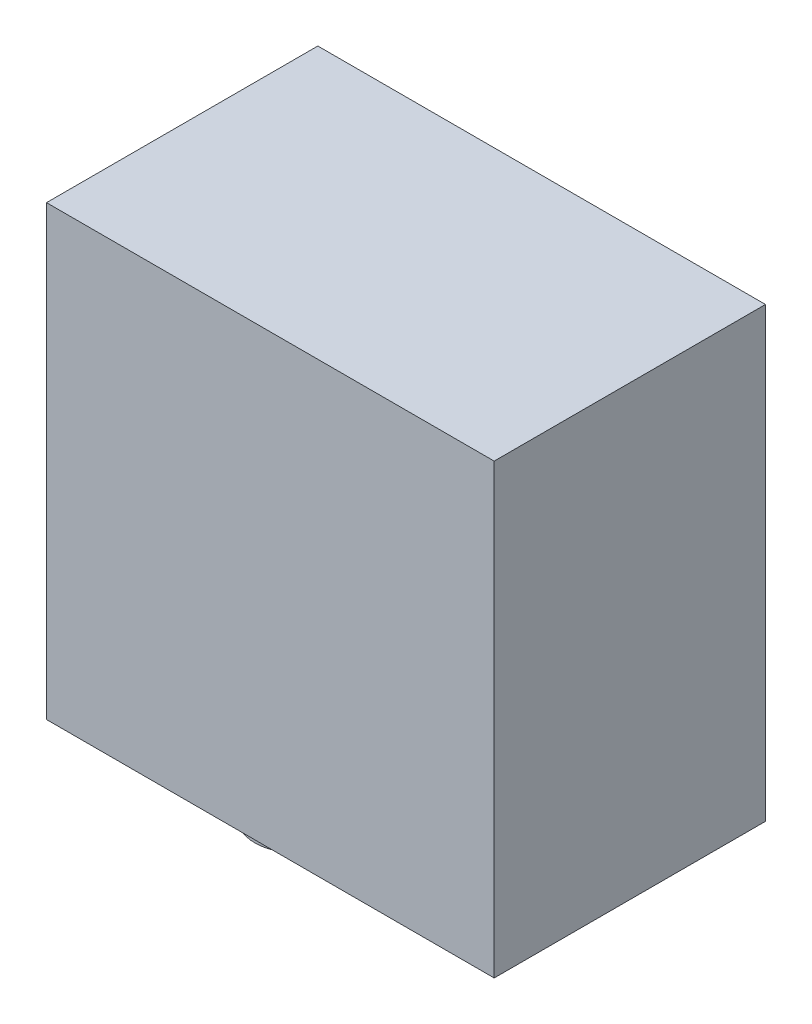
ISO-10303-21;
HEADER;
FILE_DESCRIPTION(('STEP AP214'),'2;1');
FILE_NAME('part.step','',(''),(''),'','','');
FILE_SCHEMA(('AUTOMOTIVE_DESIGN { 1 0 10303 214 1 1 1 1 }'));
ENDSEC;
DATA;
#1=APPLICATION_CONTEXT('core data for automotive mechanical design processes');
#2=APPLICATION_PROTOCOL_DEFINITION('international standard','automotive_design',2000,#1);
#3=PRODUCT_CONTEXT('',#1,'mechanical');
#4=PRODUCT('Part','Part','',(#3));
#5=PRODUCT_RELATED_PRODUCT_CATEGORY('part','',(#4));
#6=PRODUCT_DEFINITION_FORMATION('','',#4);
#7=PRODUCT_DEFINITION_CONTEXT('part definition',#1,'design');
#8=PRODUCT_DEFINITION('design','',#6,#7);
#9=PRODUCT_DEFINITION_SHAPE('','',#8);
#10=(LENGTH_UNIT() NAMED_UNIT(*) SI_UNIT(.MILLI.,.METRE.));
#11=(NAMED_UNIT(*) PLANE_ANGLE_UNIT() SI_UNIT($,.RADIAN.));
#12=(NAMED_UNIT(*) SI_UNIT($,.STERADIAN.) SOLID_ANGLE_UNIT());
#13=UNCERTAINTY_MEASURE_WITH_UNIT(LENGTH_MEASURE(1.E-05),#10,'distance_accuracy_value','');
#14=(GEOMETRIC_REPRESENTATION_CONTEXT(3) GLOBAL_UNCERTAINTY_ASSIGNED_CONTEXT((#13)) GLOBAL_UNIT_ASSIGNED_CONTEXT((#10,
#11,#12)) REPRESENTATION_CONTEXT('',''));
#15=CARTESIAN_POINT('',(0.,0.,0.));
#16=DIRECTION('',(0.,0.,1.));
#17=DIRECTION('',(1.,0.,0.));
#18=AXIS2_PLACEMENT_3D('',#15,#16,#17);
#19=CARTESIAN_POINT('',(16.5,16.5,20.));
#20=DIRECTION('',(-1.,0.,0.));
#21=DIRECTION('',(0.,-1.,0.));
#22=AXIS2_PLACEMENT_3D('',#19,#20,#21);
#23=PLANE('',#22);
#24=DIRECTION('',(0.,1.,0.));
#25=VECTOR('',#24,1.);
#26=CARTESIAN_POINT('',(16.5,16.5,0.));
#27=LINE('',#26,#25);
#28=CARTESIAN_POINT('',(16.5,-16.5,0.));
#29=VERTEX_POINT('',#28);
#30=CARTESIAN_POINT('',(16.5,16.5,0.));
#31=VERTEX_POINT('',#30);
#32=EDGE_CURVE('E99',#29,#31,#27,.T.);
#33=ORIENTED_EDGE('',*,*,#32,.T.);
#34=DIRECTION('',(0.,0.,-1.));
#35=VECTOR('',#34,1.);
#36=CARTESIAN_POINT('',(16.5,16.5,20.));
#37=LINE('',#36,#35);
#38=CARTESIAN_POINT('',(16.5,16.5,20.));
#39=VERTEX_POINT('',#38);
#40=EDGE_CURVE('E41',#39,#31,#37,.T.);
#41=ORIENTED_EDGE('',*,*,#40,.F.);
#42=DIRECTION('',(0.,1.,0.));
#43=VECTOR('',#42,1.);
#44=CARTESIAN_POINT('',(16.5,16.5,20.));
#45=LINE('',#44,#43);
#46=CARTESIAN_POINT('',(16.5,-16.5,20.));
#47=VERTEX_POINT('',#46);
#48=EDGE_CURVE('E85',#47,#39,#45,.T.);
#49=ORIENTED_EDGE('',*,*,#48,.F.);
#50=DIRECTION('',(0.,0.,-1.));
#51=VECTOR('',#50,1.);
#52=CARTESIAN_POINT('',(16.5,-16.5,20.));
#53=LINE('',#52,#51);
#54=EDGE_CURVE('E95',#47,#29,#53,.T.);
#55=ORIENTED_EDGE('',*,*,#54,.T.);
#56=EDGE_LOOP('',(#33,#41,#49,#55));
#57=FACE_BOUND('',#56,.T.);
#58=ADVANCED_FACE('F33',(#57),#23,.F.);
#59=CARTESIAN_POINT('',(-16.5,16.5,20.));
#60=DIRECTION('',(0.,-1.,0.));
#61=DIRECTION('',(0.,0.,-1.));
#62=AXIS2_PLACEMENT_3D('',#59,#60,#61);
#63=PLANE('',#62);
#64=DIRECTION('',(-1.,0.,0.));
#65=VECTOR('',#64,1.);
#66=CARTESIAN_POINT('',(-16.5,16.5,0.));
#67=LINE('',#66,#65);
#68=CARTESIAN_POINT('',(-16.5,16.5,0.));
#69=VERTEX_POINT('',#68);
#70=EDGE_CURVE('E90',#31,#69,#67,.T.);
#71=ORIENTED_EDGE('',*,*,#70,.T.);
#72=DIRECTION('',(0.,0.,-1.));
#73=VECTOR('',#72,1.);
#74=CARTESIAN_POINT('',(-16.5,16.5,20.));
#75=LINE('',#74,#73);
#76=CARTESIAN_POINT('',(-16.5,16.5,20.));
#77=VERTEX_POINT('',#76);
#78=EDGE_CURVE('E88',#77,#69,#75,.T.);
#79=ORIENTED_EDGE('',*,*,#78,.F.);
#80=DIRECTION('',(-1.,0.,0.));
#81=VECTOR('',#80,1.);
#82=CARTESIAN_POINT('',(-16.5,16.5,20.));
#83=LINE('',#82,#81);
#84=EDGE_CURVE('E80',#39,#77,#83,.T.);
#85=ORIENTED_EDGE('',*,*,#84,.F.);
#86=ORIENTED_EDGE('',*,*,#40,.T.);
#87=EDGE_LOOP('',(#71,#79,#85,#86));
#88=FACE_BOUND('',#87,.T.);
#89=ADVANCED_FACE('F89',(#88),#63,.F.);
#90=CARTESIAN_POINT('',(-16.5,16.5,20.));
#91=DIRECTION('',(1.,0.,0.));
#92=DIRECTION('',(0.,1.,0.));
#93=AXIS2_PLACEMENT_3D('',#90,#91,#92);
#94=PLANE('',#93);
#95=DIRECTION('',(0.,-1.,0.));
#96=VECTOR('',#95,1.);
#97=CARTESIAN_POINT('',(-16.5,16.5,0.));
#98=LINE('',#97,#96);
#99=CARTESIAN_POINT('',(-16.5,-16.5,0.));
#100=VERTEX_POINT('',#99);
#101=EDGE_CURVE('E66',#69,#100,#98,.T.);
#102=ORIENTED_EDGE('',*,*,#101,.T.);
#103=DIRECTION('',(0.,0.,-1.));
#104=VECTOR('',#103,1.);
#105=CARTESIAN_POINT('',(-16.5,-16.5,20.));
#106=LINE('',#105,#104);
#107=CARTESIAN_POINT('',(-16.5,-16.5,20.));
#108=VERTEX_POINT('',#107);
#109=EDGE_CURVE('E91',#108,#100,#106,.T.);
#110=ORIENTED_EDGE('',*,*,#109,.F.);
#111=DIRECTION('',(0.,-1.,0.));
#112=VECTOR('',#111,1.);
#113=CARTESIAN_POINT('',(-16.5,16.5,20.));
#114=LINE('',#113,#112);
#115=EDGE_CURVE('E83',#77,#108,#114,.T.);
#116=ORIENTED_EDGE('',*,*,#115,.F.);
#117=ORIENTED_EDGE('',*,*,#78,.T.);
#118=EDGE_LOOP('',(#102,#110,#116,#117));
#119=FACE_BOUND('',#118,.T.);
#120=ADVANCED_FACE('F93',(#119),#94,.F.);
#121=CARTESIAN_POINT('',(-16.5,-16.5,20.));
#122=DIRECTION('',(0.,1.,0.));
#123=DIRECTION('',(0.,0.,1.));
#124=AXIS2_PLACEMENT_3D('',#121,#122,#123);
#125=PLANE('',#124);
#126=CARTESIAN_POINT('',(-10.9341939718206,-16.5,7.17978500878758));
#127=DIRECTION('',(0.,1.,0.));
#128=DIRECTION('',(0.,0.,1.));
#129=AXIS2_PLACEMENT_3D('',#126,#127,#128);
#130=CIRCLE('',#129,3.018628297166);
#131=CARTESIAN_POINT('',(-10.9341939718206,-16.5,10.1984133059536));
#132=VERTEX_POINT('',#131);
#133=EDGE_CURVE('E11',#132,#132,#130,.F.);
#134=ORIENTED_EDGE('',*,*,#133,.F.);
#135=EDGE_LOOP('',(#134));
#136=FACE_BOUND('',#135,.T.);
#137=DIRECTION('',(1.,0.,0.));
#138=VECTOR('',#137,1.);
#139=CARTESIAN_POINT('',(-16.5,-16.5,0.));
#140=LINE('',#139,#138);
#141=EDGE_CURVE('E72',#100,#29,#140,.T.);
#142=ORIENTED_EDGE('',*,*,#141,.T.);
#143=ORIENTED_EDGE('',*,*,#54,.F.);
#144=DIRECTION('',(1.,0.,0.));
#145=VECTOR('',#144,1.);
#146=CARTESIAN_POINT('',(-16.5,-16.5,20.));
#147=LINE('',#146,#145);
#148=EDGE_CURVE('E49',#108,#47,#147,.T.);
#149=ORIENTED_EDGE('',*,*,#148,.F.);
#150=ORIENTED_EDGE('',*,*,#109,.T.);
#151=EDGE_LOOP('',(#142,#143,#149,#150));
#152=FACE_BOUND('',#151,.T.);
#153=ADVANCED_FACE('F121',(#136,#152),#125,.F.);
#154=CARTESIAN_POINT('',(0.,0.,20.));
#155=DIRECTION('',(0.,0.,1.));
#156=DIRECTION('',(1.,0.,0.));
#157=AXIS2_PLACEMENT_3D('',#154,#155,#156);
#158=PLANE('',#157);
#159=ORIENTED_EDGE('',*,*,#48,.T.);
#160=ORIENTED_EDGE('',*,*,#84,.T.);
#161=ORIENTED_EDGE('',*,*,#115,.T.);
#162=ORIENTED_EDGE('',*,*,#148,.T.);
#163=EDGE_LOOP('',(#159,#160,#161,#162));
#164=FACE_BOUND('',#163,.T.);
#165=ADVANCED_FACE('F81',(#164),#158,.T.);
#166=CARTESIAN_POINT('',(0.,0.,0.));
#167=DIRECTION('',(0.,0.,1.));
#168=DIRECTION('',(1.,0.,0.));
#169=AXIS2_PLACEMENT_3D('',#166,#167,#168);
#170=PLANE('',#169);
#171=ORIENTED_EDGE('',*,*,#32,.F.);
#172=ORIENTED_EDGE('',*,*,#141,.F.);
#173=ORIENTED_EDGE('',*,*,#101,.F.);
#174=ORIENTED_EDGE('',*,*,#70,.F.);
#175=EDGE_LOOP('',(#171,#172,#173,#174));
#176=FACE_BOUND('',#175,.T.);
#177=ADVANCED_FACE('F110',(#176),#170,.F.);
#178=CARTESIAN_POINT('',(-10.9341939718206,-26.5,7.17978500878758));
#179=DIRECTION('',(0.,1.,0.));
#180=DIRECTION('',(0.,0.,1.));
#181=AXIS2_PLACEMENT_3D('',#178,#179,#180);
#182=CYLINDRICAL_SURFACE('',#181,3.018628297166);
#183=CARTESIAN_POINT('',(-10.9341939718206,-26.5,7.17978500878758));
#184=DIRECTION('',(0.,-1.,0.));
#185=DIRECTION('',(0.,0.,-1.));
#186=AXIS2_PLACEMENT_3D('',#183,#184,#185);
#187=CIRCLE('',#186,3.018628297166);
#188=CARTESIAN_POINT('',(-10.9341939718206,-26.5,4.16115671162157));
#189=VERTEX_POINT('',#188);
#190=EDGE_CURVE('E102',#189,#189,#187,.T.);
#191=ORIENTED_EDGE('',*,*,#190,.F.);
#192=EDGE_LOOP('',(#191));
#193=FACE_BOUND('',#192,.T.);
#194=ORIENTED_EDGE('',*,*,#133,.T.);
#195=EDGE_LOOP('',(#194));
#196=FACE_BOUND('',#195,.T.);
#197=ADVANCED_FACE('F112',(#193,#196),#182,.T.);
#198=CARTESIAN_POINT('',(-10.9341939718206,-26.5,7.17978500878758));
#199=DIRECTION('',(0.,-1.,0.));
#200=DIRECTION('',(0.,0.,-1.));
#201=AXIS2_PLACEMENT_3D('',#198,#199,#200);
#202=PLANE('',#201);
#203=ORIENTED_EDGE('',*,*,#190,.T.);
#204=EDGE_LOOP('',(#203));
#205=FACE_BOUND('',#204,.T.);
#206=ADVANCED_FACE('F118',(#205),#202,.T.);
#207=CLOSED_SHELL('',(#58,#89,#120,#153,#165,#177,#197,#206));
#208=MANIFOLD_SOLID_BREP('B2',#207);
#209=ADVANCED_BREP_SHAPE_REPRESENTATION('',(#18,#208),#14);
#210=SHAPE_DEFINITION_REPRESENTATION(#9,#209);
ENDSEC;
END-ISO-10303-21;
